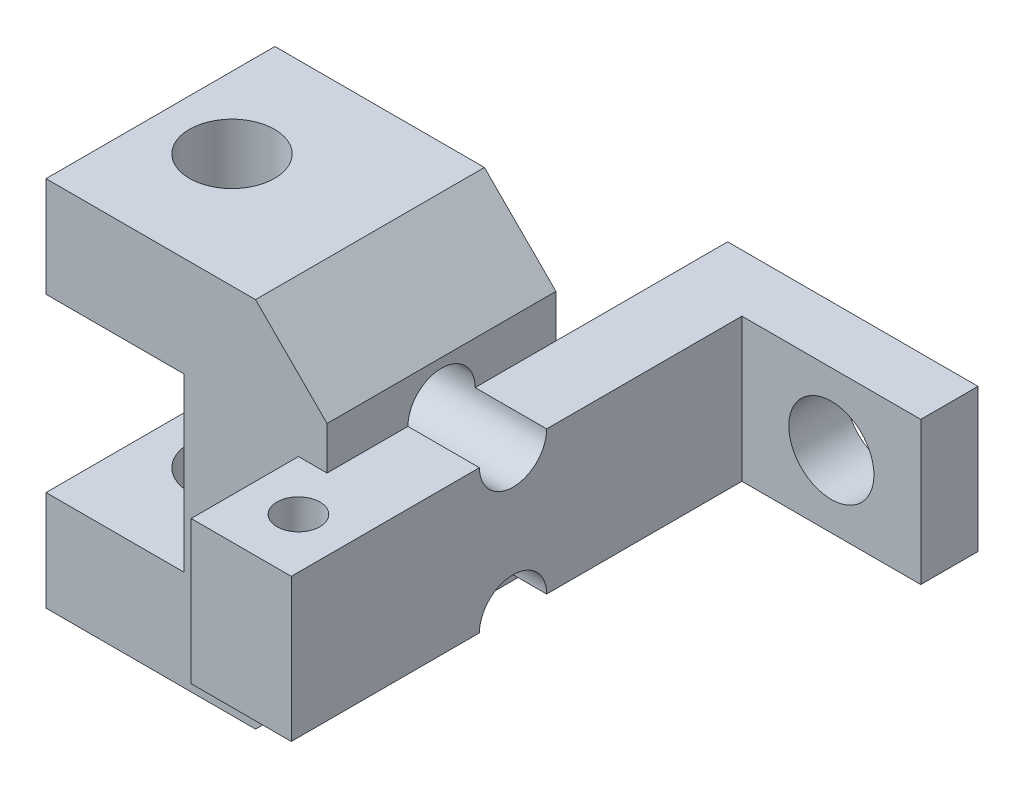
ISO-10303-21;
HEADER;
FILE_DESCRIPTION(('STEP AP214'),'2;1');
FILE_NAME('part.step','',(''),(''),'','','');
FILE_SCHEMA(('AUTOMOTIVE_DESIGN { 1 0 10303 214 1 1 1 1 }'));
ENDSEC;
DATA;
#1=APPLICATION_CONTEXT('core data for automotive mechanical design processes');
#2=APPLICATION_PROTOCOL_DEFINITION('international standard','automotive_design',2000,#1);
#3=PRODUCT_CONTEXT('',#1,'mechanical');
#4=PRODUCT('Part','Part','',(#3));
#5=PRODUCT_RELATED_PRODUCT_CATEGORY('part','',(#4));
#6=PRODUCT_DEFINITION_FORMATION('','',#4);
#7=PRODUCT_DEFINITION_CONTEXT('part definition',#1,'design');
#8=PRODUCT_DEFINITION('design','',#6,#7);
#9=PRODUCT_DEFINITION_SHAPE('','',#8);
#10=(LENGTH_UNIT() NAMED_UNIT(*) SI_UNIT(.MILLI.,.METRE.));
#11=(NAMED_UNIT(*) PLANE_ANGLE_UNIT() SI_UNIT($,.RADIAN.));
#12=(NAMED_UNIT(*) SI_UNIT($,.STERADIAN.) SOLID_ANGLE_UNIT());
#13=UNCERTAINTY_MEASURE_WITH_UNIT(LENGTH_MEASURE(1.E-05),#10,'distance_accuracy_value','');
#14=(GEOMETRIC_REPRESENTATION_CONTEXT(3) GLOBAL_UNCERTAINTY_ASSIGNED_CONTEXT((#13)) GLOBAL_UNIT_ASSIGNED_CONTEXT((#10,
#11,#12)) REPRESENTATION_CONTEXT('',''));
#15=CARTESIAN_POINT('',(0.,0.,0.));
#16=DIRECTION('',(0.,0.,1.));
#17=DIRECTION('',(1.,0.,0.));
#18=AXIS2_PLACEMENT_3D('',#15,#16,#17);
#19=CARTESIAN_POINT('',(3.81,4.572,-3.048));
#20=DIRECTION('',(-1.,0.,0.));
#21=DIRECTION('',(0.,0.,1.));
#22=AXIS2_PLACEMENT_3D('',#19,#20,#21);
#23=PLANE('',#22);
#24=CARTESIAN_POINT('',(3.81,2.032,2.032));
#25=DIRECTION('',(-1.,0.,0.));
#26=DIRECTION('',(0.,0.,1.));
#27=AXIS2_PLACEMENT_3D('',#24,#25,#26);
#28=CIRCLE('',#27,0.5969);
#29=CARTESIAN_POINT('',(3.81,2.032,1.4351));
#30=VERTEX_POINT('',#29);
#31=CARTESIAN_POINT('',(3.81,2.032,2.6289));
#32=VERTEX_POINT('',#31);
#33=EDGE_CURVE('E54',#30,#32,#28,.F.);
#34=ORIENTED_EDGE('',*,*,#33,.F.);
#35=DIRECTION('',(0.,0.,-1.));
#36=VECTOR('',#35,1.);
#37=CARTESIAN_POINT('',(3.81,2.032,5.969));
#38=LINE('',#37,#36);
#39=CARTESIAN_POINT('',(3.81,2.032,-2.032));
#40=VERTEX_POINT('',#39);
#41=EDGE_CURVE('E317',#30,#40,#38,.T.);
#42=ORIENTED_EDGE('',*,*,#41,.T.);
#43=DIRECTION('',(0.,-1.,0.));
#44=VECTOR('',#43,1.);
#45=CARTESIAN_POINT('',(3.81,4.572,-2.032));
#46=LINE('',#45,#44);
#47=CARTESIAN_POINT('',(3.81,4.572,-2.032));
#48=VERTEX_POINT('',#47);
#49=EDGE_CURVE('E493',#48,#40,#46,.T.);
#50=ORIENTED_EDGE('',*,*,#49,.F.);
#51=DIRECTION('',(0.,0.,1.));
#52=VECTOR('',#51,1.);
#53=CARTESIAN_POINT('',(3.81,4.572,5.969));
#54=LINE('',#53,#52);
#55=CARTESIAN_POINT('',(3.81,4.572,1.4351));
#56=VERTEX_POINT('',#55);
#57=EDGE_CURVE('E332',#48,#56,#54,.T.);
#58=ORIENTED_EDGE('',*,*,#57,.T.);
#59=CARTESIAN_POINT('',(3.81,4.572,2.032));
#60=DIRECTION('',(-1.,0.,0.));
#61=DIRECTION('',(0.,0.,1.));
#62=AXIS2_PLACEMENT_3D('',#59,#60,#61);
#63=CIRCLE('',#62,0.5969);
#64=CARTESIAN_POINT('',(3.81,4.572,2.6289));
#65=VERTEX_POINT('',#64);
#66=EDGE_CURVE('E478',#65,#56,#63,.F.);
#67=ORIENTED_EDGE('',*,*,#66,.F.);
#68=CARTESIAN_POINT('',(3.81,4.572,5.969));
#69=VERTEX_POINT('',#68);
#70=EDGE_CURVE('E296',#65,#69,#54,.T.);
#71=ORIENTED_EDGE('',*,*,#70,.T.);
#72=DIRECTION('',(0.,-1.,0.));
#73=VECTOR('',#72,1.);
#74=CARTESIAN_POINT('',(3.81,4.572,5.969));
#75=LINE('',#74,#73);
#76=CARTESIAN_POINT('',(3.81,2.032,5.969));
#77=VERTEX_POINT('',#76);
#78=EDGE_CURVE('E310',#69,#77,#75,.T.);
#79=ORIENTED_EDGE('',*,*,#78,.T.);
#80=EDGE_CURVE('E293',#77,#32,#38,.T.);
#81=ORIENTED_EDGE('',*,*,#80,.T.);
#82=EDGE_LOOP('',(#34,#42,#50,#58,#67,#71,#79,#81));
#83=FACE_BOUND('',#82,.T.);
#84=ADVANCED_FACE('F32',(#83),#23,.F.);
#85=CARTESIAN_POINT('',(0.,1.778,4.064));
#86=DIRECTION('',(1.,0.,0.));
#87=DIRECTION('',(0.,0.,-1.));
#88=AXIS2_PLACEMENT_3D('',#85,#86,#87);
#89=PLANE('',#88);
#90=CARTESIAN_POINT('',(0.,2.032,2.032));
#91=DIRECTION('',(1.,0.,0.));
#92=DIRECTION('',(0.,-1.,0.));
#93=AXIS2_PLACEMENT_3D('',#90,#91,#92);
#94=CIRCLE('',#93,0.5969);
#95=CARTESIAN_POINT('',(0.,1.778,1.49183927391933));
#96=VERTEX_POINT('',#95);
#97=CARTESIAN_POINT('',(0.,1.778,2.57216072608067));
#98=VERTEX_POINT('',#97);
#99=EDGE_CURVE('E47',#96,#98,#94,.T.);
#100=ORIENTED_EDGE('',*,*,#99,.T.);
#101=DIRECTION('',(0.,0.,-1.));
#102=VECTOR('',#101,1.);
#103=CARTESIAN_POINT('',(0.,1.778,4.064));
#104=LINE('',#103,#102);
#105=CARTESIAN_POINT('',(0.,1.778,4.064));
#106=VERTEX_POINT('',#105);
#107=EDGE_CURVE('E205',#106,#98,#104,.T.);
#108=ORIENTED_EDGE('',*,*,#107,.F.);
#109=DIRECTION('',(0.,-1.,0.));
#110=VECTOR('',#109,1.);
#111=CARTESIAN_POINT('',(0.,1.778,4.064));
#112=LINE('',#111,#110);
#113=CARTESIAN_POINT('',(0.,4.826,4.064));
#114=VERTEX_POINT('',#113);
#115=EDGE_CURVE('E266',#114,#106,#112,.T.);
#116=ORIENTED_EDGE('',*,*,#115,.F.);
#117=DIRECTION('',(0.,0.,-1.));
#118=VECTOR('',#117,1.);
#119=CARTESIAN_POINT('',(0.,4.826,4.064));
#120=LINE('',#119,#118);
#121=CARTESIAN_POINT('',(0.,4.826,2.57216072608067));
#122=VERTEX_POINT('',#121);
#123=EDGE_CURVE('E224',#114,#122,#120,.T.);
#124=ORIENTED_EDGE('',*,*,#123,.T.);
#125=CARTESIAN_POINT('',(0.,4.572,2.032));
#126=DIRECTION('',(1.,0.,0.));
#127=DIRECTION('',(0.,1.,0.));
#128=AXIS2_PLACEMENT_3D('',#125,#126,#127);
#129=CIRCLE('',#128,0.5969);
#130=CARTESIAN_POINT('',(0.,4.826,1.49183927391933));
#131=VERTEX_POINT('',#130);
#132=EDGE_CURVE('E369',#122,#131,#129,.T.);
#133=ORIENTED_EDGE('',*,*,#132,.T.);
#134=CARTESIAN_POINT('',(0.,4.826,0.));
#135=VERTEX_POINT('',#134);
#136=EDGE_CURVE('E221',#131,#135,#120,.T.);
#137=ORIENTED_EDGE('',*,*,#136,.T.);
#138=DIRECTION('',(0.,-1.,0.));
#139=VECTOR('',#138,1.);
#140=CARTESIAN_POINT('',(0.,1.778,0.));
#141=LINE('',#140,#139);
#142=CARTESIAN_POINT('',(0.,1.778,0.));
#143=VERTEX_POINT('',#142);
#144=EDGE_CURVE('E243',#135,#143,#141,.T.);
#145=ORIENTED_EDGE('',*,*,#144,.T.);
#146=EDGE_CURVE('E206',#96,#143,#104,.T.);
#147=ORIENTED_EDGE('',*,*,#146,.F.);
#148=EDGE_LOOP('',(#100,#108,#116,#124,#133,#137,#145,#147));
#149=FACE_BOUND('',#148,.T.);
#150=ADVANCED_FACE('F213',(#149),#89,.F.);
#151=CARTESIAN_POINT('',(2.54,5.334,4.064));
#152=DIRECTION('',(-1.,0.,0.));
#153=DIRECTION('',(0.,-1.,0.));
#154=AXIS2_PLACEMENT_3D('',#151,#152,#153);
#155=PLANE('',#154);
#156=CARTESIAN_POINT('',(2.54,2.032,2.032));
#157=DIRECTION('',(-1.,0.,0.));
#158=DIRECTION('',(0.,-1.,0.));
#159=AXIS2_PLACEMENT_3D('',#156,#157,#158);
#160=CIRCLE('',#159,0.5969);
#161=CARTESIAN_POINT('',(2.54,2.032,2.6289));
#162=VERTEX_POINT('',#161);
#163=CARTESIAN_POINT('',(2.54,2.032,1.4351));
#164=VERTEX_POINT('',#163);
#165=EDGE_CURVE('E217',#162,#164,#160,.F.);
#166=ORIENTED_EDGE('',*,*,#165,.F.);
#167=DIRECTION('',(0.,0.,-1.));
#168=VECTOR('',#167,1.);
#169=CARTESIAN_POINT('',(2.54,2.032,5.969));
#170=LINE('',#169,#168);
#171=CARTESIAN_POINT('',(2.54,2.032,4.064));
#172=VERTEX_POINT('',#171);
#173=EDGE_CURVE('E299',#172,#162,#170,.T.);
#174=ORIENTED_EDGE('',*,*,#173,.F.);
#175=DIRECTION('',(0.,1.,0.));
#176=VECTOR('',#175,1.);
#177=CARTESIAN_POINT('',(2.54,5.334,4.064));
#178=LINE('',#177,#176);
#179=CARTESIAN_POINT('',(2.54,1.27,4.064));
#180=VERTEX_POINT('',#179);
#181=EDGE_CURVE('E276',#180,#172,#178,.T.);
#182=ORIENTED_EDGE('',*,*,#181,.F.);
#183=DIRECTION('',(0.,0.,-1.));
#184=VECTOR('',#183,1.);
#185=CARTESIAN_POINT('',(2.54,1.27,4.064));
#186=LINE('',#185,#184);
#187=CARTESIAN_POINT('',(2.54,1.27,0.));
#188=VERTEX_POINT('',#187);
#189=EDGE_CURVE('E344',#180,#188,#186,.T.);
#190=ORIENTED_EDGE('',*,*,#189,.T.);
#191=DIRECTION('',(0.,1.,0.));
#192=VECTOR('',#191,1.);
#193=CARTESIAN_POINT('',(2.54,5.334,0.));
#194=LINE('',#193,#192);
#195=CARTESIAN_POINT('',(2.54,2.032,0.));
#196=VERTEX_POINT('',#195);
#197=EDGE_CURVE('E255',#188,#196,#194,.T.);
#198=ORIENTED_EDGE('',*,*,#197,.T.);
#199=EDGE_CURVE('E298',#164,#196,#170,.T.);
#200=ORIENTED_EDGE('',*,*,#199,.F.);
#201=EDGE_LOOP('',(#166,#174,#182,#190,#198,#200));
#202=FACE_BOUND('',#201,.T.);
#203=ADVANCED_FACE('F420',(#202),#155,.F.);
#204=CARTESIAN_POINT('',(3.81,2.032,5.969));
#205=DIRECTION('',(0.,1.,0.));
#206=DIRECTION('',(-1.,0.,0.));
#207=AXIS2_PLACEMENT_3D('',#204,#205,#206);
#208=PLANE('',#207);
#209=DIRECTION('',(-1.,0.,0.));
#210=VECTOR('',#209,1.);
#211=CARTESIAN_POINT('',(6.985025,2.032,1.4351));
#212=LINE('',#211,#210);
#213=EDGE_CURVE('E11',#164,#30,#212,.F.);
#214=ORIENTED_EDGE('',*,*,#213,.F.);
#215=ORIENTED_EDGE('',*,*,#199,.T.);
#216=CARTESIAN_POINT('',(2.54,2.032,-3.048));
#217=VERTEX_POINT('',#216);
#218=EDGE_CURVE('E294',#196,#217,#170,.T.);
#219=ORIENTED_EDGE('',*,*,#218,.T.);
#220=DIRECTION('',(-1.,0.,0.));
#221=VECTOR('',#220,1.);
#222=CARTESIAN_POINT('',(3.81,2.032,-3.048));
#223=LINE('',#222,#221);
#224=CARTESIAN_POINT('',(6.985,2.032,-3.048));
#225=VERTEX_POINT('',#224);
#226=EDGE_CURVE('E290',#225,#217,#223,.T.);
#227=ORIENTED_EDGE('',*,*,#226,.F.);
#228=DIRECTION('',(0.,0.,-1.));
#229=VECTOR('',#228,1.);
#230=CARTESIAN_POINT('',(6.985,2.032,-2.032));
#231=LINE('',#230,#229);
#232=CARTESIAN_POINT('',(6.985,2.032,-2.032));
#233=VERTEX_POINT('',#232);
#234=EDGE_CURVE('E489',#233,#225,#231,.T.);
#235=ORIENTED_EDGE('',*,*,#234,.F.);
#236=DIRECTION('',(-1.,0.,0.));
#237=VECTOR('',#236,1.);
#238=CARTESIAN_POINT('',(6.985,2.032,-2.032));
#239=LINE('',#238,#237);
#240=EDGE_CURVE('E500',#233,#40,#239,.T.);
#241=ORIENTED_EDGE('',*,*,#240,.T.);
#242=ORIENTED_EDGE('',*,*,#41,.F.);
#243=EDGE_LOOP('',(#214,#215,#219,#227,#235,#241,#242));
#244=FACE_BOUND('',#243,.T.);
#245=ADVANCED_FACE('F431',(#244),#208,.F.);
#246=CARTESIAN_POINT('',(2.921,2.032,4.953));
#247=DIRECTION('',(0.,-1.,0.));
#248=DIRECTION('',(1.,0.,0.));
#249=AXIS2_PLACEMENT_3D('',#246,#247,#248);
#250=CIRCLE('',#249,0.381);
#251=CARTESIAN_POINT('',(3.302,2.032,4.953));
#252=VERTEX_POINT('',#251);
#253=EDGE_CURVE('E480',#252,#252,#250,.T.);
#254=ORIENTED_EDGE('',*,*,#253,.F.);
#255=EDGE_LOOP('',(#254));
#256=FACE_BOUND('',#255,.T.);
#257=DIRECTION('',(-1.,0.,0.));
#258=VECTOR('',#257,1.);
#259=CARTESIAN_POINT('',(6.985025,2.032,2.6289));
#260=LINE('',#259,#258);
#261=EDGE_CURVE('E41',#32,#162,#260,.T.);
#262=ORIENTED_EDGE('',*,*,#261,.F.);
#263=ORIENTED_EDGE('',*,*,#80,.F.);
#264=DIRECTION('',(-1.,0.,0.));
#265=VECTOR('',#264,1.);
#266=CARTESIAN_POINT('',(3.81,2.032,5.969));
#267=LINE('',#266,#265);
#268=CARTESIAN_POINT('',(2.032,2.032,5.969));
#269=VERTEX_POINT('',#268);
#270=EDGE_CURVE('E288',#77,#269,#267,.T.);
#271=ORIENTED_EDGE('',*,*,#270,.T.);
#272=DIRECTION('',(0.,0.,1.));
#273=VECTOR('',#272,1.);
#274=CARTESIAN_POINT('',(2.032,2.032,5.969));
#275=LINE('',#274,#273);
#276=CARTESIAN_POINT('',(2.032,2.032,4.064));
#277=VERTEX_POINT('',#276);
#278=EDGE_CURVE('E503',#277,#269,#275,.T.);
#279=ORIENTED_EDGE('',*,*,#278,.F.);
#280=DIRECTION('',(1.,0.,0.));
#281=VECTOR('',#280,1.);
#282=CARTESIAN_POINT('',(2.032,2.032,4.064));
#283=LINE('',#282,#281);
#284=EDGE_CURVE('E528',#277,#172,#283,.T.);
#285=ORIENTED_EDGE('',*,*,#284,.T.);
#286=ORIENTED_EDGE('',*,*,#173,.T.);
#287=EDGE_LOOP('',(#262,#263,#271,#279,#285,#286));
#288=FACE_BOUND('',#287,.T.);
#289=ADVANCED_FACE('F434',(#256,#288),#208,.F.);
#290=CARTESIAN_POINT('',(2.54,4.572,2.032));
#291=DIRECTION('',(-1.,0.,0.));
#292=DIRECTION('',(0.,-1.,0.));
#293=AXIS2_PLACEMENT_3D('',#290,#291,#292);
#294=CIRCLE('',#293,0.5969);
#295=CARTESIAN_POINT('',(2.54,4.572,1.4351));
#296=VERTEX_POINT('',#295);
#297=CARTESIAN_POINT('',(2.54,4.572,2.6289));
#298=VERTEX_POINT('',#297);
#299=EDGE_CURVE('E371',#296,#298,#294,.F.);
#300=ORIENTED_EDGE('',*,*,#299,.F.);
#301=DIRECTION('',(0.,0.,1.));
#302=VECTOR('',#301,1.);
#303=CARTESIAN_POINT('',(2.54,4.572,5.969));
#304=LINE('',#303,#302);
#305=CARTESIAN_POINT('',(2.54,4.572,0.));
#306=VERTEX_POINT('',#305);
#307=EDGE_CURVE('E304',#306,#296,#304,.T.);
#308=ORIENTED_EDGE('',*,*,#307,.F.);
#309=CARTESIAN_POINT('',(2.54,5.334,0.));
#310=VERTEX_POINT('',#309);
#311=EDGE_CURVE('E259',#306,#310,#194,.T.);
#312=ORIENTED_EDGE('',*,*,#311,.T.);
#313=DIRECTION('',(0.,0.,-1.));
#314=VECTOR('',#313,1.);
#315=CARTESIAN_POINT('',(2.54,5.334,4.064));
#316=LINE('',#315,#314);
#317=CARTESIAN_POINT('',(2.54,5.334,4.064));
#318=VERTEX_POINT('',#317);
#319=EDGE_CURVE('E347',#318,#310,#316,.T.);
#320=ORIENTED_EDGE('',*,*,#319,.F.);
#321=CARTESIAN_POINT('',(2.54,4.572,4.064));
#322=VERTEX_POINT('',#321);
#323=EDGE_CURVE('E279',#322,#318,#178,.T.);
#324=ORIENTED_EDGE('',*,*,#323,.F.);
#325=EDGE_CURVE('E303',#298,#322,#304,.T.);
#326=ORIENTED_EDGE('',*,*,#325,.F.);
#327=EDGE_LOOP('',(#300,#308,#312,#320,#324,#326));
#328=FACE_BOUND('',#327,.T.);
#329=ADVANCED_FACE('F444',(#328),#155,.F.);
#330=CARTESIAN_POINT('',(3.81,4.572,5.969));
#331=DIRECTION('',(0.,-1.,0.));
#332=DIRECTION('',(1.,0.,0.));
#333=AXIS2_PLACEMENT_3D('',#330,#331,#332);
#334=PLANE('',#333);
#335=CARTESIAN_POINT('',(2.921,4.572,4.953));
#336=DIRECTION('',(0.,-1.,0.));
#337=DIRECTION('',(1.,0.,0.));
#338=AXIS2_PLACEMENT_3D('',#335,#336,#337);
#339=CIRCLE('',#338,0.381);
#340=CARTESIAN_POINT('',(3.302,4.572,4.953));
#341=VERTEX_POINT('',#340);
#342=EDGE_CURVE('E483',#341,#341,#339,.T.);
#343=ORIENTED_EDGE('',*,*,#342,.T.);
#344=EDGE_LOOP('',(#343));
#345=FACE_BOUND('',#344,.T.);
#346=DIRECTION('',(-1.,0.,0.));
#347=VECTOR('',#346,1.);
#348=CARTESIAN_POINT('',(6.985025,4.572,2.6289));
#349=LINE('',#348,#347);
#350=EDGE_CURVE('E320',#298,#65,#349,.F.);
#351=ORIENTED_EDGE('',*,*,#350,.F.);
#352=ORIENTED_EDGE('',*,*,#325,.T.);
#353=DIRECTION('',(1.,0.,0.));
#354=VECTOR('',#353,1.);
#355=CARTESIAN_POINT('',(2.032,4.572,4.064));
#356=LINE('',#355,#354);
#357=CARTESIAN_POINT('',(2.032,4.572,4.064));
#358=VERTEX_POINT('',#357);
#359=EDGE_CURVE('E307',#358,#322,#356,.T.);
#360=ORIENTED_EDGE('',*,*,#359,.F.);
#361=DIRECTION('',(0.,0.,-1.));
#362=VECTOR('',#361,1.);
#363=CARTESIAN_POINT('',(2.032,4.572,4.064));
#364=LINE('',#363,#362);
#365=CARTESIAN_POINT('',(2.032,4.572,5.969));
#366=VERTEX_POINT('',#365);
#367=EDGE_CURVE('E522',#366,#358,#364,.T.);
#368=ORIENTED_EDGE('',*,*,#367,.F.);
#369=DIRECTION('',(-1.,0.,0.));
#370=VECTOR('',#369,1.);
#371=CARTESIAN_POINT('',(3.81,4.572,5.969));
#372=LINE('',#371,#370);
#373=EDGE_CURVE('E286',#69,#366,#372,.T.);
#374=ORIENTED_EDGE('',*,*,#373,.F.);
#375=ORIENTED_EDGE('',*,*,#70,.F.);
#376=EDGE_LOOP('',(#351,#352,#360,#368,#374,#375));
#377=FACE_BOUND('',#376,.T.);
#378=ADVANCED_FACE('F440',(#345,#377),#334,.F.);
#379=DIRECTION('',(-1.,0.,0.));
#380=VECTOR('',#379,1.);
#381=CARTESIAN_POINT('',(6.985025,4.572,1.4351));
#382=LINE('',#381,#380);
#383=EDGE_CURVE('E323',#56,#296,#382,.T.);
#384=ORIENTED_EDGE('',*,*,#383,.F.);
#385=ORIENTED_EDGE('',*,*,#57,.F.);
#386=DIRECTION('',(-1.,0.,0.));
#387=VECTOR('',#386,1.);
#388=CARTESIAN_POINT('',(6.985,4.572,-2.032));
#389=LINE('',#388,#387);
#390=CARTESIAN_POINT('',(6.985,4.572,-2.032));
#391=VERTEX_POINT('',#390);
#392=EDGE_CURVE('E509',#391,#48,#389,.T.);
#393=ORIENTED_EDGE('',*,*,#392,.F.);
#394=DIRECTION('',(0.,0.,1.));
#395=VECTOR('',#394,1.);
#396=CARTESIAN_POINT('',(6.985,4.572,-3.048));
#397=LINE('',#396,#395);
#398=CARTESIAN_POINT('',(6.985,4.572,-3.048));
#399=VERTEX_POINT('',#398);
#400=EDGE_CURVE('E496',#399,#391,#397,.T.);
#401=ORIENTED_EDGE('',*,*,#400,.F.);
#402=DIRECTION('',(-1.,0.,0.));
#403=VECTOR('',#402,1.);
#404=CARTESIAN_POINT('',(3.81,4.572,-3.048));
#405=LINE('',#404,#403);
#406=CARTESIAN_POINT('',(2.54,4.572,-3.048));
#407=VERTEX_POINT('',#406);
#408=EDGE_CURVE('E262',#399,#407,#405,.T.);
#409=ORIENTED_EDGE('',*,*,#408,.T.);
#410=EDGE_CURVE('E297',#407,#306,#304,.T.);
#411=ORIENTED_EDGE('',*,*,#410,.T.);
#412=ORIENTED_EDGE('',*,*,#307,.T.);
#413=EDGE_LOOP('',(#384,#385,#393,#401,#409,#411,#412));
#414=FACE_BOUND('',#413,.T.);
#415=ADVANCED_FACE('F443',(#414),#334,.F.);
#416=CARTESIAN_POINT('',(2.54,0.,4.064));
#417=DIRECTION('',(0.,0.,-1.));
#418=DIRECTION('',(-1.,0.,0.));
#419=AXIS2_PLACEMENT_3D('',#416,#417,#418);
#420=PLANE('',#419);
#421=ORIENTED_EDGE('',*,*,#284,.F.);
#422=DIRECTION('',(0.,-1.,0.));
#423=VECTOR('',#422,1.);
#424=CARTESIAN_POINT('',(2.032,2.032,4.064));
#425=LINE('',#424,#423);
#426=EDGE_CURVE('E525',#358,#277,#425,.T.);
#427=ORIENTED_EDGE('',*,*,#426,.F.);
#428=ORIENTED_EDGE('',*,*,#359,.T.);
#429=ORIENTED_EDGE('',*,*,#323,.T.);
#430=DIRECTION('',(-0.707106781186549,0.707106781186546,0.));
#431=VECTOR('',#430,1.);
#432=CARTESIAN_POINT('',(1.27,6.604,4.064));
#433=LINE('',#432,#431);
#434=CARTESIAN_POINT('',(1.27,6.604,4.064));
#435=VERTEX_POINT('',#434);
#436=EDGE_CURVE('E274',#318,#435,#433,.T.);
#437=ORIENTED_EDGE('',*,*,#436,.T.);
#438=DIRECTION('',(-1.,0.,0.));
#439=VECTOR('',#438,1.);
#440=CARTESIAN_POINT('',(0.,6.604,4.064));
#441=LINE('',#440,#439);
#442=CARTESIAN_POINT('',(-2.45,6.604,4.064));
#443=VERTEX_POINT('',#442);
#444=EDGE_CURVE('E272',#435,#443,#441,.T.);
#445=ORIENTED_EDGE('',*,*,#444,.T.);
#446=DIRECTION('',(0.,-1.,0.));
#447=VECTOR('',#446,1.);
#448=CARTESIAN_POINT('',(-2.45,4.826,4.064));
#449=LINE('',#448,#447);
#450=CARTESIAN_POINT('',(-2.45,4.826,4.064));
#451=VERTEX_POINT('',#450);
#452=EDGE_CURVE('E270',#443,#451,#449,.T.);
#453=ORIENTED_EDGE('',*,*,#452,.T.);
#454=DIRECTION('',(1.,0.,0.));
#455=VECTOR('',#454,1.);
#456=CARTESIAN_POINT('',(0.,4.826,4.064));
#457=LINE('',#456,#455);
#458=EDGE_CURVE('E268',#451,#114,#457,.T.);
#459=ORIENTED_EDGE('',*,*,#458,.T.);
#460=ORIENTED_EDGE('',*,*,#115,.T.);
#461=DIRECTION('',(-1.,0.,0.));
#462=VECTOR('',#461,1.);
#463=CARTESIAN_POINT('',(-2.45,1.778,4.064));
#464=LINE('',#463,#462);
#465=CARTESIAN_POINT('',(-2.45,1.778,4.064));
#466=VERTEX_POINT('',#465);
#467=EDGE_CURVE('E220',#106,#466,#464,.T.);
#468=ORIENTED_EDGE('',*,*,#467,.T.);
#469=DIRECTION('',(0.,-1.,0.));
#470=VECTOR('',#469,1.);
#471=CARTESIAN_POINT('',(-2.45,0.,4.064));
#472=LINE('',#471,#470);
#473=CARTESIAN_POINT('',(-2.45,0.,4.064));
#474=VERTEX_POINT('',#473);
#475=EDGE_CURVE('E233',#466,#474,#472,.T.);
#476=ORIENTED_EDGE('',*,*,#475,.T.);
#477=DIRECTION('',(1.,0.,0.));
#478=VECTOR('',#477,1.);
#479=CARTESIAN_POINT('',(0.,0.,4.064));
#480=LINE('',#479,#478);
#481=CARTESIAN_POINT('',(1.27,0.,4.064));
#482=VERTEX_POINT('',#481);
#483=EDGE_CURVE('E238',#474,#482,#480,.T.);
#484=ORIENTED_EDGE('',*,*,#483,.T.);
#485=DIRECTION('',(0.707106781186546,0.707106781186549,0.));
#486=VECTOR('',#485,1.);
#487=CARTESIAN_POINT('',(1.27,0.,4.064));
#488=LINE('',#487,#486);
#489=EDGE_CURVE('E280',#482,#180,#488,.T.);
#490=ORIENTED_EDGE('',*,*,#489,.T.);
#491=ORIENTED_EDGE('',*,*,#181,.T.);
#492=EDGE_LOOP('',(#421,#427,#428,#429,#437,#445,#453,#459,#460,#468,#476,#484,#490,#491));
#493=FACE_BOUND('',#492,.T.);
#494=ADVANCED_FACE('F388',(#493),#420,.F.);
#495=CARTESIAN_POINT('',(1.27,0.,4.064));
#496=DIRECTION('',(-0.707106781186549,0.707106781186546,0.));
#497=DIRECTION('',(-0.707106781186546,-0.707106781186549,0.));
#498=AXIS2_PLACEMENT_3D('',#495,#496,#497);
#499=PLANE('',#498);
#500=DIRECTION('',(0.707106781186546,0.707106781186549,0.));
#501=VECTOR('',#500,1.);
#502=CARTESIAN_POINT('',(1.27,0.,0.));
#503=LINE('',#502,#501);
#504=CARTESIAN_POINT('',(1.27,0.,0.));
#505=VERTEX_POINT('',#504);
#506=EDGE_CURVE('E260',#505,#188,#503,.T.);
#507=ORIENTED_EDGE('',*,*,#506,.T.);
#508=ORIENTED_EDGE('',*,*,#189,.F.);
#509=ORIENTED_EDGE('',*,*,#489,.F.);
#510=DIRECTION('',(0.,0.,-1.));
#511=VECTOR('',#510,1.);
#512=CARTESIAN_POINT('',(1.27,0.,4.064));
#513=LINE('',#512,#511);
#514=EDGE_CURVE('E341',#482,#505,#513,.T.);
#515=ORIENTED_EDGE('',*,*,#514,.T.);
#516=EDGE_LOOP('',(#507,#508,#509,#515));
#517=FACE_BOUND('',#516,.T.);
#518=ADVANCED_FACE('F34',(#517),#499,.F.);
#519=CARTESIAN_POINT('',(1.27,6.604,4.064));
#520=DIRECTION('',(-0.707106781186546,-0.707106781186549,0.));
#521=DIRECTION('',(0.707106781186549,-0.707106781186546,0.));
#522=AXIS2_PLACEMENT_3D('',#519,#520,#521);
#523=PLANE('',#522);
#524=DIRECTION('',(-0.707106781186549,0.707106781186546,0.));
#525=VECTOR('',#524,1.);
#526=CARTESIAN_POINT('',(1.27,6.604,0.));
#527=LINE('',#526,#525);
#528=CARTESIAN_POINT('',(1.27,6.604,0.));
#529=VERTEX_POINT('',#528);
#530=EDGE_CURVE('E252',#310,#529,#527,.T.);
#531=ORIENTED_EDGE('',*,*,#530,.T.);
#532=DIRECTION('',(0.,0.,-1.));
#533=VECTOR('',#532,1.);
#534=CARTESIAN_POINT('',(1.27,6.604,4.064));
#535=LINE('',#534,#533);
#536=EDGE_CURVE('E350',#435,#529,#535,.T.);
#537=ORIENTED_EDGE('',*,*,#536,.F.);
#538=ORIENTED_EDGE('',*,*,#436,.F.);
#539=ORIENTED_EDGE('',*,*,#319,.T.);
#540=EDGE_LOOP('',(#531,#537,#538,#539));
#541=FACE_BOUND('',#540,.T.);
#542=ADVANCED_FACE('F400',(#541),#523,.F.);
#543=CARTESIAN_POINT('',(-2.45,6.604,4.064));
#544=DIRECTION('',(0.,-1.,0.));
#545=DIRECTION('',(1.,0.,0.));
#546=AXIS2_PLACEMENT_3D('',#543,#544,#545);
#547=PLANE('',#546);
#548=CARTESIAN_POINT('',(-1.18,6.604,2.032));
#549=DIRECTION('',(0.,1.,0.));
#550=DIRECTION('',(-1.,0.,0.));
#551=AXIS2_PLACEMENT_3D('',#548,#549,#550);
#552=CIRCLE('',#551,0.75565);
#553=CARTESIAN_POINT('',(-1.93565,6.604,2.032));
#554=VERTEX_POINT('',#553);
#555=EDGE_CURVE('E596',#554,#554,#552,.T.);
#556=ORIENTED_EDGE('',*,*,#555,.F.);
#557=EDGE_LOOP('',(#556));
#558=FACE_BOUND('',#557,.T.);
#559=DIRECTION('',(-1.,0.,0.));
#560=VECTOR('',#559,1.);
#561=CARTESIAN_POINT('',(-2.45,6.604,0.));
#562=LINE('',#561,#560);
#563=CARTESIAN_POINT('',(-2.45,6.604,0.));
#564=VERTEX_POINT('',#563);
#565=EDGE_CURVE('E250',#529,#564,#562,.T.);
#566=ORIENTED_EDGE('',*,*,#565,.T.);
#567=DIRECTION('',(0.,0.,-1.));
#568=VECTOR('',#567,1.);
#569=CARTESIAN_POINT('',(-2.45,6.604,4.064));
#570=LINE('',#569,#568);
#571=EDGE_CURVE('E353',#443,#564,#570,.T.);
#572=ORIENTED_EDGE('',*,*,#571,.F.);
#573=ORIENTED_EDGE('',*,*,#444,.F.);
#574=ORIENTED_EDGE('',*,*,#536,.T.);
#575=EDGE_LOOP('',(#566,#572,#573,#574));
#576=FACE_BOUND('',#575,.T.);
#577=ADVANCED_FACE('F403',(#558,#576),#547,.F.);
#578=CARTESIAN_POINT('',(-2.45,4.826,4.064));
#579=DIRECTION('',(1.,0.,0.));
#580=DIRECTION('',(0.,0.,-1.));
#581=AXIS2_PLACEMENT_3D('',#578,#579,#580);
#582=PLANE('',#581);
#583=DIRECTION('',(0.,-1.,0.));
#584=VECTOR('',#583,1.);
#585=CARTESIAN_POINT('',(-2.45,4.826,0.));
#586=LINE('',#585,#584);
#587=CARTESIAN_POINT('',(-2.45,4.826,0.));
#588=VERTEX_POINT('',#587);
#589=EDGE_CURVE('E248',#564,#588,#586,.T.);
#590=ORIENTED_EDGE('',*,*,#589,.T.);
#591=DIRECTION('',(0.,0.,-1.));
#592=VECTOR('',#591,1.);
#593=CARTESIAN_POINT('',(-2.45,4.826,4.064));
#594=LINE('',#593,#592);
#595=EDGE_CURVE('E356',#451,#588,#594,.T.);
#596=ORIENTED_EDGE('',*,*,#595,.F.);
#597=ORIENTED_EDGE('',*,*,#452,.F.);
#598=ORIENTED_EDGE('',*,*,#571,.T.);
#599=EDGE_LOOP('',(#590,#596,#597,#598));
#600=FACE_BOUND('',#599,.T.);
#601=ADVANCED_FACE('F394',(#600),#582,.F.);
#602=CARTESIAN_POINT('',(0.,4.826,4.064));
#603=DIRECTION('',(0.,1.,0.));
#604=DIRECTION('',(0.,0.,1.));
#605=AXIS2_PLACEMENT_3D('',#602,#603,#604);
#606=PLANE('',#605);
#607=CARTESIAN_POINT('',(-1.18,4.826,2.032));
#608=DIRECTION('',(0.,1.,0.));
#609=DIRECTION('',(0.,0.,1.));
#610=AXIS2_PLACEMENT_3D('',#607,#608,#609);
#611=CIRCLE('',#610,0.75565);
#612=CARTESIAN_POINT('',(-1.18,4.826,2.78765));
#613=VERTEX_POINT('',#612);
#614=EDGE_CURVE('E209',#613,#613,#611,.T.);
#615=ORIENTED_EDGE('',*,*,#614,.T.);
#616=EDGE_LOOP('',(#615));
#617=FACE_BOUND('',#616,.T.);
#618=DIRECTION('',(1.,0.,0.));
#619=VECTOR('',#618,1.);
#620=CARTESIAN_POINT('',(0.,4.826,0.));
#621=LINE('',#620,#619);
#622=EDGE_CURVE('E245',#588,#135,#621,.T.);
#623=ORIENTED_EDGE('',*,*,#622,.T.);
#624=ORIENTED_EDGE('',*,*,#136,.F.);
#625=EDGE_CURVE('E222',#122,#131,#120,.T.);
#626=ORIENTED_EDGE('',*,*,#625,.F.);
#627=ORIENTED_EDGE('',*,*,#123,.F.);
#628=ORIENTED_EDGE('',*,*,#458,.F.);
#629=ORIENTED_EDGE('',*,*,#595,.T.);
#630=EDGE_LOOP('',(#623,#624,#626,#627,#628,#629));
#631=FACE_BOUND('',#630,.T.);
#632=ADVANCED_FACE('F373',(#617,#631),#606,.F.);
#633=CARTESIAN_POINT('',(-2.45,1.778,4.064));
#634=DIRECTION('',(0.,-1.,0.));
#635=DIRECTION('',(0.,0.,-1.));
#636=AXIS2_PLACEMENT_3D('',#633,#634,#635);
#637=PLANE('',#636);
#638=CARTESIAN_POINT('',(-1.18,1.778,2.032));
#639=DIRECTION('',(0.,-1.,0.));
#640=DIRECTION('',(0.,0.,-1.));
#641=AXIS2_PLACEMENT_3D('',#638,#639,#640);
#642=CIRCLE('',#641,0.75565);
#643=CARTESIAN_POINT('',(-1.18,1.778,1.27635));
#644=VERTEX_POINT('',#643);
#645=EDGE_CURVE('E469',#644,#644,#642,.T.);
#646=ORIENTED_EDGE('',*,*,#645,.T.);
#647=EDGE_LOOP('',(#646));
#648=FACE_BOUND('',#647,.T.);
#649=DIRECTION('',(-1.,0.,0.));
#650=VECTOR('',#649,1.);
#651=CARTESIAN_POINT('',(-2.45,1.778,0.));
#652=LINE('',#651,#650);
#653=CARTESIAN_POINT('',(-2.45,1.778,0.));
#654=VERTEX_POINT('',#653);
#655=EDGE_CURVE('E241',#143,#654,#652,.T.);
#656=ORIENTED_EDGE('',*,*,#655,.T.);
#657=DIRECTION('',(0.,0.,-1.));
#658=VECTOR('',#657,1.);
#659=CARTESIAN_POINT('',(-2.45,1.778,4.064));
#660=LINE('',#659,#658);
#661=EDGE_CURVE('E226',#466,#654,#660,.T.);
#662=ORIENTED_EDGE('',*,*,#661,.F.);
#663=ORIENTED_EDGE('',*,*,#467,.F.);
#664=ORIENTED_EDGE('',*,*,#107,.T.);
#665=EDGE_CURVE('E199',#98,#96,#104,.T.);
#666=ORIENTED_EDGE('',*,*,#665,.T.);
#667=ORIENTED_EDGE('',*,*,#146,.T.);
#668=EDGE_LOOP('',(#656,#662,#663,#664,#666,#667));
#669=FACE_BOUND('',#668,.T.);
#670=ADVANCED_FACE('F218',(#648,#669),#637,.F.);
#671=CARTESIAN_POINT('',(-2.45,0.,4.064));
#672=DIRECTION('',(1.,0.,0.));
#673=DIRECTION('',(0.,1.,0.));
#674=AXIS2_PLACEMENT_3D('',#671,#672,#673);
#675=PLANE('',#674);
#676=DIRECTION('',(0.,-1.,0.));
#677=VECTOR('',#676,1.);
#678=CARTESIAN_POINT('',(-2.45,0.,0.));
#679=LINE('',#678,#677);
#680=CARTESIAN_POINT('',(-2.45,0.,0.));
#681=VERTEX_POINT('',#680);
#682=EDGE_CURVE('E239',#654,#681,#679,.T.);
#683=ORIENTED_EDGE('',*,*,#682,.T.);
#684=DIRECTION('',(0.,0.,-1.));
#685=VECTOR('',#684,1.);
#686=CARTESIAN_POINT('',(-2.45,0.,4.064));
#687=LINE('',#686,#685);
#688=EDGE_CURVE('E228',#474,#681,#687,.T.);
#689=ORIENTED_EDGE('',*,*,#688,.F.);
#690=ORIENTED_EDGE('',*,*,#475,.F.);
#691=ORIENTED_EDGE('',*,*,#661,.T.);
#692=EDGE_LOOP('',(#683,#689,#690,#691));
#693=FACE_BOUND('',#692,.T.);
#694=ADVANCED_FACE('F385',(#693),#675,.F.);
#695=CARTESIAN_POINT('',(0.,0.,4.064));
#696=DIRECTION('',(0.,1.,0.));
#697=DIRECTION('',(-1.,0.,0.));
#698=AXIS2_PLACEMENT_3D('',#695,#696,#697);
#699=PLANE('',#698);
#700=CARTESIAN_POINT('',(-1.18,0.,2.032));
#701=DIRECTION('',(0.,1.,0.));
#702=DIRECTION('',(-1.,0.,0.));
#703=AXIS2_PLACEMENT_3D('',#700,#701,#702);
#704=CIRCLE('',#703,0.75565);
#705=CARTESIAN_POINT('',(-1.93565,0.,2.032));
#706=VERTEX_POINT('',#705);
#707=EDGE_CURVE('E36',#706,#706,#704,.T.);
#708=ORIENTED_EDGE('',*,*,#707,.T.);
#709=EDGE_LOOP('',(#708));
#710=FACE_BOUND('',#709,.T.);
#711=DIRECTION('',(1.,0.,0.));
#712=VECTOR('',#711,1.);
#713=CARTESIAN_POINT('',(0.,0.,0.));
#714=LINE('',#713,#712);
#715=EDGE_CURVE('E236',#681,#505,#714,.T.);
#716=ORIENTED_EDGE('',*,*,#715,.T.);
#717=ORIENTED_EDGE('',*,*,#514,.F.);
#718=ORIENTED_EDGE('',*,*,#483,.F.);
#719=ORIENTED_EDGE('',*,*,#688,.T.);
#720=EDGE_LOOP('',(#716,#717,#718,#719));
#721=FACE_BOUND('',#720,.T.);
#722=ADVANCED_FACE('F453',(#710,#721),#699,.F.);
#723=CARTESIAN_POINT('',(2.54,0.,0.));
#724=DIRECTION('',(0.,0.,-1.));
#725=DIRECTION('',(-1.,0.,0.));
#726=AXIS2_PLACEMENT_3D('',#723,#724,#725);
#727=PLANE('',#726);
#728=ORIENTED_EDGE('',*,*,#506,.F.);
#729=ORIENTED_EDGE('',*,*,#715,.F.);
#730=ORIENTED_EDGE('',*,*,#682,.F.);
#731=ORIENTED_EDGE('',*,*,#655,.F.);
#732=ORIENTED_EDGE('',*,*,#144,.F.);
#733=ORIENTED_EDGE('',*,*,#622,.F.);
#734=ORIENTED_EDGE('',*,*,#589,.F.);
#735=ORIENTED_EDGE('',*,*,#565,.F.);
#736=ORIENTED_EDGE('',*,*,#530,.F.);
#737=ORIENTED_EDGE('',*,*,#311,.F.);
#738=EDGE_CURVE('E258',#196,#306,#194,.T.);
#739=ORIENTED_EDGE('',*,*,#738,.F.);
#740=ORIENTED_EDGE('',*,*,#197,.F.);
#741=EDGE_LOOP('',(#728,#729,#730,#731,#732,#733,#734,#735,#736,#737,#739,#740));
#742=FACE_BOUND('',#741,.T.);
#743=ADVANCED_FACE('F382',(#742),#727,.T.);
#744=CARTESIAN_POINT('',(3.81,2.032,-3.048));
#745=DIRECTION('',(0.,0.,1.));
#746=DIRECTION('',(1.,0.,0.));
#747=AXIS2_PLACEMENT_3D('',#744,#745,#746);
#748=PLANE('',#747);
#749=CARTESIAN_POINT('',(5.3975,3.302,-3.048));
#750=DIRECTION('',(0.,0.,-1.));
#751=DIRECTION('',(-1.,0.,0.));
#752=AXIS2_PLACEMENT_3D('',#749,#750,#751);
#753=CIRCLE('',#752,0.75565);
#754=CARTESIAN_POINT('',(4.64185,3.302,-3.048));
#755=VERTEX_POINT('',#754);
#756=EDGE_CURVE('E486',#755,#755,#753,.T.);
#757=ORIENTED_EDGE('',*,*,#756,.F.);
#758=EDGE_LOOP('',(#757));
#759=FACE_BOUND('',#758,.T.);
#760=DIRECTION('',(0.,1.,0.));
#761=VECTOR('',#760,1.);
#762=CARTESIAN_POINT('',(2.54,2.032,-3.048));
#763=LINE('',#762,#761);
#764=EDGE_CURVE('E302',#217,#407,#763,.T.);
#765=ORIENTED_EDGE('',*,*,#764,.T.);
#766=ORIENTED_EDGE('',*,*,#408,.F.);
#767=DIRECTION('',(0.,1.,0.));
#768=VECTOR('',#767,1.);
#769=CARTESIAN_POINT('',(6.985,2.032,-3.048));
#770=LINE('',#769,#768);
#771=EDGE_CURVE('E492',#225,#399,#770,.T.);
#772=ORIENTED_EDGE('',*,*,#771,.F.);
#773=ORIENTED_EDGE('',*,*,#226,.T.);
#774=EDGE_LOOP('',(#765,#766,#772,#773));
#775=FACE_BOUND('',#774,.T.);
#776=ADVANCED_FACE('F438',(#759,#775),#748,.F.);
#777=CARTESIAN_POINT('',(3.81,4.572,5.969));
#778=DIRECTION('',(0.,0.,-1.));
#779=DIRECTION('',(-1.,0.,0.));
#780=AXIS2_PLACEMENT_3D('',#777,#778,#779);
#781=PLANE('',#780);
#782=ORIENTED_EDGE('',*,*,#373,.T.);
#783=DIRECTION('',(0.,1.,0.));
#784=VECTOR('',#783,1.);
#785=CARTESIAN_POINT('',(2.032,4.572,5.969));
#786=LINE('',#785,#784);
#787=EDGE_CURVE('E518',#269,#366,#786,.T.);
#788=ORIENTED_EDGE('',*,*,#787,.F.);
#789=ORIENTED_EDGE('',*,*,#270,.F.);
#790=ORIENTED_EDGE('',*,*,#78,.F.);
#791=EDGE_LOOP('',(#782,#788,#789,#790));
#792=FACE_BOUND('',#791,.T.);
#793=ADVANCED_FACE('F429',(#792),#781,.F.);
#794=CARTESIAN_POINT('',(2.54,4.572,-3.048));
#795=DIRECTION('',(-1.,0.,0.));
#796=DIRECTION('',(0.,0.,1.));
#797=AXIS2_PLACEMENT_3D('',#794,#795,#796);
#798=PLANE('',#797);
#799=ORIENTED_EDGE('',*,*,#218,.F.);
#800=ORIENTED_EDGE('',*,*,#738,.T.);
#801=ORIENTED_EDGE('',*,*,#410,.F.);
#802=ORIENTED_EDGE('',*,*,#764,.F.);
#803=EDGE_LOOP('',(#799,#800,#801,#802));
#804=FACE_BOUND('',#803,.T.);
#805=ADVANCED_FACE('F426',(#804),#798,.T.);
#806=CARTESIAN_POINT('',(2.032,2.032,4.064));
#807=DIRECTION('',(1.,0.,0.));
#808=DIRECTION('',(0.,0.,-1.));
#809=AXIS2_PLACEMENT_3D('',#806,#807,#808);
#810=PLANE('',#809);
#811=ORIENTED_EDGE('',*,*,#278,.T.);
#812=ORIENTED_EDGE('',*,*,#787,.T.);
#813=ORIENTED_EDGE('',*,*,#367,.T.);
#814=ORIENTED_EDGE('',*,*,#426,.T.);
#815=EDGE_LOOP('',(#811,#812,#813,#814));
#816=FACE_BOUND('',#815,.T.);
#817=ADVANCED_FACE('F424',(#816),#810,.F.);
#818=CARTESIAN_POINT('',(6.985,4.572,-2.032));
#819=DIRECTION('',(0.,0.,-1.));
#820=DIRECTION('',(0.,1.,0.));
#821=AXIS2_PLACEMENT_3D('',#818,#819,#820);
#822=PLANE('',#821);
#823=CARTESIAN_POINT('',(5.3975,3.302,-2.032));
#824=DIRECTION('',(0.,0.,-1.));
#825=DIRECTION('',(0.,1.,0.));
#826=AXIS2_PLACEMENT_3D('',#823,#824,#825);
#827=CIRCLE('',#826,0.75565);
#828=CARTESIAN_POINT('',(5.3975,4.05765,-2.032));
#829=VERTEX_POINT('',#828);
#830=EDGE_CURVE('E333',#829,#829,#827,.T.);
#831=ORIENTED_EDGE('',*,*,#830,.T.);
#832=EDGE_LOOP('',(#831));
#833=FACE_BOUND('',#832,.T.);
#834=ORIENTED_EDGE('',*,*,#49,.T.);
#835=ORIENTED_EDGE('',*,*,#240,.F.);
#836=DIRECTION('',(0.,-1.,0.));
#837=VECTOR('',#836,1.);
#838=CARTESIAN_POINT('',(6.985,4.572,-2.032));
#839=LINE('',#838,#837);
#840=EDGE_CURVE('E498',#391,#233,#839,.T.);
#841=ORIENTED_EDGE('',*,*,#840,.F.);
#842=ORIENTED_EDGE('',*,*,#392,.T.);
#843=EDGE_LOOP('',(#834,#835,#841,#842));
#844=FACE_BOUND('',#843,.T.);
#845=ADVANCED_FACE('F561',(#833,#844),#822,.F.);
#846=CARTESIAN_POINT('',(6.985,2.032,-3.048));
#847=DIRECTION('',(1.,0.,0.));
#848=DIRECTION('',(0.,0.,-1.));
#849=AXIS2_PLACEMENT_3D('',#846,#847,#848);
#850=PLANE('',#849);
#851=ORIENTED_EDGE('',*,*,#234,.T.);
#852=ORIENTED_EDGE('',*,*,#771,.T.);
#853=ORIENTED_EDGE('',*,*,#400,.T.);
#854=ORIENTED_EDGE('',*,*,#840,.T.);
#855=EDGE_LOOP('',(#851,#852,#853,#854));
#856=FACE_BOUND('',#855,.T.);
#857=ADVANCED_FACE('F563',(#856),#850,.T.);
#858=CARTESIAN_POINT('',(5.3975,3.302,0.127));
#859=DIRECTION('',(0.,0.,-1.));
#860=DIRECTION('',(-1.,0.,0.));
#861=AXIS2_PLACEMENT_3D('',#858,#859,#860);
#862=CYLINDRICAL_SURFACE('',#861,0.75565);
#863=ORIENTED_EDGE('',*,*,#756,.T.);
#864=EDGE_LOOP('',(#863));
#865=FACE_BOUND('',#864,.T.);
#866=ORIENTED_EDGE('',*,*,#830,.F.);
#867=EDGE_LOOP('',(#866));
#868=FACE_BOUND('',#867,.T.);
#869=ADVANCED_FACE('F565',(#865,#868),#862,.F.);
#870=CARTESIAN_POINT('',(2.921,5.207,4.953));
#871=DIRECTION('',(0.,-1.,0.));
#872=DIRECTION('',(1.,0.,0.));
#873=AXIS2_PLACEMENT_3D('',#870,#871,#872);
#874=CYLINDRICAL_SURFACE('',#873,0.381);
#875=ORIENTED_EDGE('',*,*,#253,.T.);
#876=EDGE_LOOP('',(#875));
#877=FACE_BOUND('',#876,.T.);
#878=ORIENTED_EDGE('',*,*,#342,.F.);
#879=EDGE_LOOP('',(#878));
#880=FACE_BOUND('',#879,.T.);
#881=ADVANCED_FACE('F571',(#877,#880),#874,.F.);
#882=CARTESIAN_POINT('',(0.,4.572,2.032));
#883=DIRECTION('',(1.,0.,0.));
#884=DIRECTION('',(0.,1.,0.));
#885=AXIS2_PLACEMENT_3D('',#882,#883,#884);
#886=PLANE('',#885);
#887=ORIENTED_EDGE('',*,*,#625,.T.);
#888=EDGE_CURVE('E365',#131,#122,#129,.T.);
#889=ORIENTED_EDGE('',*,*,#888,.T.);
#890=EDGE_LOOP('',(#887,#889));
#891=FACE_BOUND('',#890,.T.);
#892=ADVANCED_FACE('F364',(#891),#886,.T.);
#893=CARTESIAN_POINT('',(6.985025,4.572,2.032));
#894=DIRECTION('',(-1.,0.,0.));
#895=DIRECTION('',(0.,-1.,0.));
#896=AXIS2_PLACEMENT_3D('',#893,#894,#895);
#897=CYLINDRICAL_SURFACE('',#896,0.5969);
#898=ORIENTED_EDGE('',*,*,#132,.F.);
#899=ORIENTED_EDGE('',*,*,#888,.F.);
#900=EDGE_LOOP('',(#898,#899));
#901=FACE_BOUND('',#900,.T.);
#902=ORIENTED_EDGE('',*,*,#350,.T.);
#903=ORIENTED_EDGE('',*,*,#66,.T.);
#904=ORIENTED_EDGE('',*,*,#383,.T.);
#905=ORIENTED_EDGE('',*,*,#299,.T.);
#906=EDGE_LOOP('',(#902,#903,#904,#905));
#907=FACE_BOUND('',#906,.T.);
#908=ADVANCED_FACE('F559',(#901,#907),#897,.F.);
#909=CARTESIAN_POINT('',(0.,2.032,2.032));
#910=DIRECTION('',(-1.,0.,0.));
#911=DIRECTION('',(0.,-1.,0.));
#912=AXIS2_PLACEMENT_3D('',#909,#910,#911);
#913=PLANE('',#912);
#914=EDGE_CURVE('E201',#98,#96,#94,.T.);
#915=ORIENTED_EDGE('',*,*,#914,.T.);
#916=ORIENTED_EDGE('',*,*,#665,.F.);
#917=EDGE_LOOP('',(#915,#916));
#918=FACE_BOUND('',#917,.T.);
#919=ADVANCED_FACE('F200',(#918),#913,.F.);
#920=CARTESIAN_POINT('',(6.985025,2.032,2.032));
#921=DIRECTION('',(-1.,0.,0.));
#922=DIRECTION('',(0.,-1.,0.));
#923=AXIS2_PLACEMENT_3D('',#920,#921,#922);
#924=CYLINDRICAL_SURFACE('',#923,0.5969);
#925=ORIENTED_EDGE('',*,*,#99,.F.);
#926=ORIENTED_EDGE('',*,*,#914,.F.);
#927=EDGE_LOOP('',(#925,#926));
#928=FACE_BOUND('',#927,.T.);
#929=ORIENTED_EDGE('',*,*,#213,.T.);
#930=ORIENTED_EDGE('',*,*,#33,.T.);
#931=ORIENTED_EDGE('',*,*,#261,.T.);
#932=ORIENTED_EDGE('',*,*,#165,.T.);
#933=EDGE_LOOP('',(#929,#930,#931,#932));
#934=FACE_BOUND('',#933,.T.);
#935=ADVANCED_FACE('F208',(#928,#934),#924,.F.);
#936=CARTESIAN_POINT('',(-1.18000000000001,-3.396,2.032));
#937=DIRECTION('',(0.,1.,0.));
#938=DIRECTION('',(-1.,0.,0.));
#939=AXIS2_PLACEMENT_3D('',#936,#937,#938);
#940=CYLINDRICAL_SURFACE('',#939,0.75565);
#941=ORIENTED_EDGE('',*,*,#707,.F.);
#942=EDGE_LOOP('',(#941));
#943=FACE_BOUND('',#942,.T.);
#944=ORIENTED_EDGE('',*,*,#645,.F.);
#945=EDGE_LOOP('',(#944));
#946=FACE_BOUND('',#945,.T.);
#947=ADVANCED_FACE('F585',(#943,#946),#940,.F.);
#948=ORIENTED_EDGE('',*,*,#555,.T.);
#949=EDGE_LOOP('',(#948));
#950=FACE_BOUND('',#949,.T.);
#951=ORIENTED_EDGE('',*,*,#614,.F.);
#952=EDGE_LOOP('',(#951));
#953=FACE_BOUND('',#952,.T.);
#954=ADVANCED_FACE('F588',(#950,#953),#940,.F.);
#955=CLOSED_SHELL('',(#84,#150,#203,#245,#289,#329,#378,#415,#494,#518,#542,#577,#601,#632,#670,
#694,#722,#743,#776,#793,#805,#817,#845,#857,#869,#881,#892,#908,#919,#935,#947,#954));
#956=MANIFOLD_SOLID_BREP('B2',#955);
#957=ADVANCED_BREP_SHAPE_REPRESENTATION('',(#18,#956),#14);
#958=SHAPE_DEFINITION_REPRESENTATION(#9,#957);
ENDSEC;
END-ISO-10303-21;
